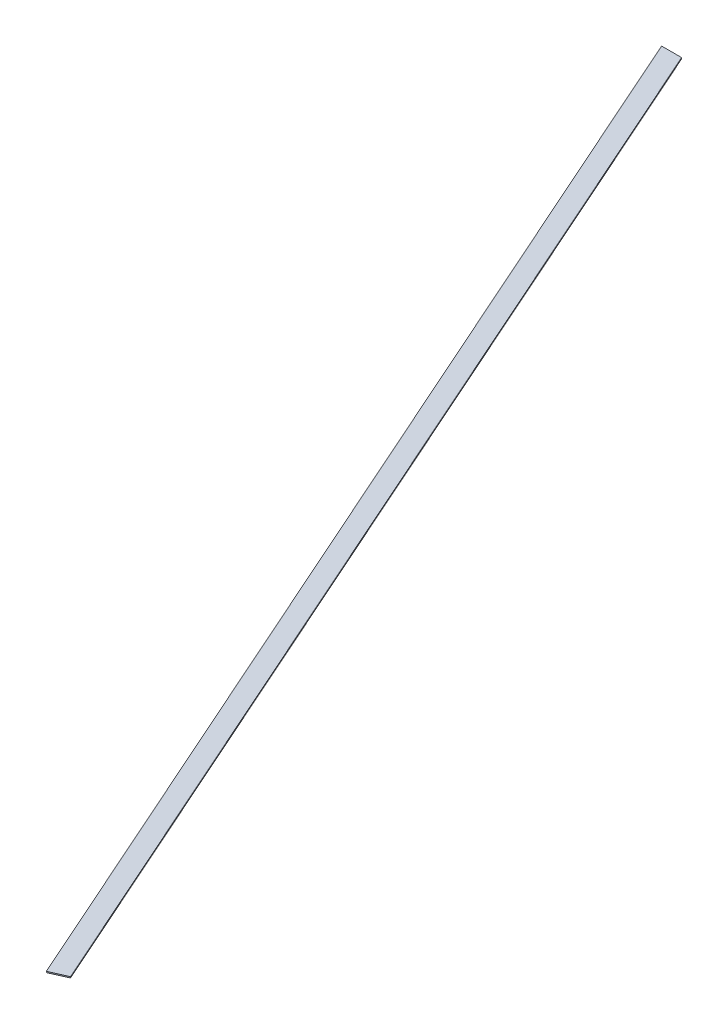
ISO-10303-21;
HEADER;
FILE_DESCRIPTION(('STEP AP214'),'2;1');
FILE_NAME('part.step','',(''),(''),'','','');
FILE_SCHEMA(('AUTOMOTIVE_DESIGN { 1 0 10303 214 1 1 1 1 }'));
ENDSEC;
DATA;
#1=APPLICATION_CONTEXT('core data for automotive mechanical design processes');
#2=APPLICATION_PROTOCOL_DEFINITION('international standard','automotive_design',2000,#1);
#3=PRODUCT_CONTEXT('',#1,'mechanical');
#4=PRODUCT('Part','Part','',(#3));
#5=PRODUCT_RELATED_PRODUCT_CATEGORY('part','',(#4));
#6=PRODUCT_DEFINITION_FORMATION('','',#4);
#7=PRODUCT_DEFINITION_CONTEXT('part definition',#1,'design');
#8=PRODUCT_DEFINITION('design','',#6,#7);
#9=PRODUCT_DEFINITION_SHAPE('','',#8);
#10=(LENGTH_UNIT() NAMED_UNIT(*) SI_UNIT(.MILLI.,.METRE.));
#11=(NAMED_UNIT(*) PLANE_ANGLE_UNIT() SI_UNIT($,.RADIAN.));
#12=(NAMED_UNIT(*) SI_UNIT($,.STERADIAN.) SOLID_ANGLE_UNIT());
#13=UNCERTAINTY_MEASURE_WITH_UNIT(LENGTH_MEASURE(1.E-05),#10,'distance_accuracy_value','');
#14=(GEOMETRIC_REPRESENTATION_CONTEXT(3) GLOBAL_UNCERTAINTY_ASSIGNED_CONTEXT((#13)) GLOBAL_UNIT_ASSIGNED_CONTEXT((#10,
#11,#12)) REPRESENTATION_CONTEXT('',''));
#15=CARTESIAN_POINT('',(0.,0.,0.));
#16=DIRECTION('',(0.,0.,1.));
#17=DIRECTION('',(1.,0.,0.));
#18=AXIS2_PLACEMENT_3D('',#15,#16,#17);
#19=CARTESIAN_POINT('',(27.8037614740545,3.175,2.45816780200209E-13));
#20=DIRECTION('',(-0.913545457642596,0.,0.406736643075811));
#21=DIRECTION('',(0.406736643075811,0.,0.913545457642596));
#22=AXIS2_PLACEMENT_3D('',#19,#20,#21);
#23=PLANE('',#22);
#24=DIRECTION('',(-0.40673664307581,0.,-0.913545457642596));
#25=VECTOR('',#24,1.);
#26=CARTESIAN_POINT('',(27.8037614740545,3.175,2.45816780200209E-13));
#27=LINE('',#26,#25);
#28=CARTESIAN_POINT('',(-444.327999075485,3.175,-1060.42529632237));
#29=VERTEX_POINT('',#28);
#30=CARTESIAN_POINT('',(-1804.22323283357,3.175,-4114.8));
#31=VERTEX_POINT('',#30);
#32=EDGE_CURVE('E85',#29,#31,#27,.T.);
#33=ORIENTED_EDGE('',*,*,#32,.F.);
#34=DIRECTION('',(0.,1.,0.));
#35=VECTOR('',#34,1.);
#36=CARTESIAN_POINT('',(-444.327999075485,0.,-1060.42529632237));
#37=LINE('',#36,#35);
#38=CARTESIAN_POINT('',(-444.327999075485,0.,-1060.42529632237));
#39=VERTEX_POINT('',#38);
#40=EDGE_CURVE('E92',#39,#29,#37,.T.);
#41=ORIENTED_EDGE('',*,*,#40,.F.);
#42=DIRECTION('',(-0.40673664307581,0.,-0.913545457642596));
#43=VECTOR('',#42,1.);
#44=CARTESIAN_POINT('',(27.8037614740545,0.,2.45816780200209E-13));
#45=LINE('',#44,#43);
#46=CARTESIAN_POINT('',(-1804.22323283357,0.,-4114.8));
#47=VERTEX_POINT('',#46);
#48=EDGE_CURVE('E77',#39,#47,#45,.T.);
#49=ORIENTED_EDGE('',*,*,#48,.T.);
#50=DIRECTION('',(0.,-1.,0.));
#51=VECTOR('',#50,1.);
#52=CARTESIAN_POINT('',(-1804.22323283357,3.175,-4114.8));
#53=LINE('',#52,#51);
#54=EDGE_CURVE('E11',#31,#47,#53,.T.);
#55=ORIENTED_EDGE('',*,*,#54,.F.);
#56=EDGE_LOOP('',(#33,#41,#49,#55));
#57=FACE_BOUND('',#56,.T.);
#58=ADVANCED_FACE('F33',(#57),#23,.F.);
#59=CARTESIAN_POINT('',(-1804.22323283357,3.175,-4114.8));
#60=DIRECTION('',(0.,0.,1.));
#61=DIRECTION('',(1.,0.,0.));
#62=AXIS2_PLACEMENT_3D('',#59,#60,#61);
#63=PLANE('',#62);
#64=DIRECTION('',(-1.,0.,0.));
#65=VECTOR('',#64,1.);
#66=CARTESIAN_POINT('',(-1804.22323283357,0.,-4114.8));
#67=LINE('',#66,#65);
#68=CARTESIAN_POINT('',(-1859.83075578167,0.,-4114.8));
#69=VERTEX_POINT('',#68);
#70=EDGE_CURVE('E68',#47,#69,#67,.T.);
#71=ORIENTED_EDGE('',*,*,#70,.T.);
#72=DIRECTION('',(0.,-1.,0.));
#73=VECTOR('',#72,1.);
#74=CARTESIAN_POINT('',(-1859.83075578167,3.175,-4114.8));
#75=LINE('',#74,#73);
#76=CARTESIAN_POINT('',(-1859.83075578167,3.175,-4114.8));
#77=VERTEX_POINT('',#76);
#78=EDGE_CURVE('E40',#77,#69,#75,.T.);
#79=ORIENTED_EDGE('',*,*,#78,.F.);
#80=DIRECTION('',(-1.,0.,0.));
#81=VECTOR('',#80,1.);
#82=CARTESIAN_POINT('',(-1804.22323283357,3.175,-4114.8));
#83=LINE('',#82,#81);
#84=EDGE_CURVE('E56',#31,#77,#83,.T.);
#85=ORIENTED_EDGE('',*,*,#84,.F.);
#86=ORIENTED_EDGE('',*,*,#54,.T.);
#87=EDGE_LOOP('',(#71,#79,#85,#86));
#88=FACE_BOUND('',#87,.T.);
#89=ADVANCED_FACE('F70',(#88),#63,.F.);
#90=CARTESIAN_POINT('',(-1859.83075578167,3.175,-4114.8));
#91=DIRECTION('',(0.913545457642596,0.,-0.40673664307581));
#92=DIRECTION('',(-0.40673664307581,0.,-0.913545457642596));
#93=AXIS2_PLACEMENT_3D('',#90,#91,#92);
#94=PLANE('',#93);
#95=DIRECTION('',(0.40673664307581,0.,0.913545457642597));
#96=VECTOR('',#95,1.);
#97=CARTESIAN_POINT('',(-1859.83075578167,0.,-4114.8));
#98=LINE('',#97,#96);
#99=CARTESIAN_POINT('',(-490.73610832373,0.,-1039.76307485412));
#100=VERTEX_POINT('',#99);
#101=EDGE_CURVE('E76',#69,#100,#98,.T.);
#102=ORIENTED_EDGE('',*,*,#101,.T.);
#103=DIRECTION('',(0.,1.,0.));
#104=VECTOR('',#103,1.);
#105=CARTESIAN_POINT('',(-490.73610832373,0.,-1039.76307485412));
#106=LINE('',#105,#104);
#107=CARTESIAN_POINT('',(-490.73610832373,3.175,-1039.76307485412));
#108=VERTEX_POINT('',#107);
#109=EDGE_CURVE('E47',#100,#108,#106,.T.);
#110=ORIENTED_EDGE('',*,*,#109,.T.);
#111=DIRECTION('',(0.40673664307581,0.,0.913545457642597));
#112=VECTOR('',#111,1.);
#113=CARTESIAN_POINT('',(-1859.83075578167,3.175,-4114.8));
#114=LINE('',#113,#112);
#115=EDGE_CURVE('E82',#77,#108,#114,.T.);
#116=ORIENTED_EDGE('',*,*,#115,.F.);
#117=ORIENTED_EDGE('',*,*,#78,.T.);
#118=EDGE_LOOP('',(#102,#110,#116,#117));
#119=FACE_BOUND('',#118,.T.);
#120=ADVANCED_FACE('F81',(#119),#94,.F.);
#121=CARTESIAN_POINT('',(0.,3.175,0.));
#122=DIRECTION('',(0.,1.,0.));
#123=DIRECTION('',(0.,0.,1.));
#124=AXIS2_PLACEMENT_3D('',#121,#122,#123);
#125=PLANE('',#124);
#126=DIRECTION('',(-0.913545457642596,0.,0.40673664307581));
#127=VECTOR('',#126,1.);
#128=CARTESIAN_POINT('',(-444.327999075485,3.175,-1060.42529632237));
#129=LINE('',#128,#127);
#130=EDGE_CURVE('E96',#29,#108,#129,.T.);
#131=ORIENTED_EDGE('',*,*,#130,.F.);
#132=ORIENTED_EDGE('',*,*,#32,.T.);
#133=ORIENTED_EDGE('',*,*,#84,.T.);
#134=ORIENTED_EDGE('',*,*,#115,.T.);
#135=EDGE_LOOP('',(#131,#132,#133,#134));
#136=FACE_BOUND('',#135,.T.);
#137=ADVANCED_FACE('F104',(#136),#125,.T.);
#138=CARTESIAN_POINT('',(0.,0.,0.));
#139=DIRECTION('',(0.,1.,0.));
#140=DIRECTION('',(0.,0.,1.));
#141=AXIS2_PLACEMENT_3D('',#138,#139,#140);
#142=PLANE('',#141);
#143=ORIENTED_EDGE('',*,*,#48,.F.);
#144=DIRECTION('',(-0.913545457642596,0.,0.40673664307581));
#145=VECTOR('',#144,1.);
#146=CARTESIAN_POINT('',(-444.327999075485,0.,-1060.42529632237));
#147=LINE('',#146,#145);
#148=EDGE_CURVE('E84',#39,#100,#147,.T.);
#149=ORIENTED_EDGE('',*,*,#148,.T.);
#150=ORIENTED_EDGE('',*,*,#101,.F.);
#151=ORIENTED_EDGE('',*,*,#70,.F.);
#152=EDGE_LOOP('',(#143,#149,#150,#151));
#153=FACE_BOUND('',#152,.T.);
#154=ADVANCED_FACE('F83',(#153),#142,.F.);
#155=CARTESIAN_POINT('',(-444.327999075485,0.,-1060.42529632237));
#156=DIRECTION('',(-0.40673664307581,0.,-0.913545457642597));
#157=DIRECTION('',(-0.913545457642597,0.,0.40673664307581));
#158=AXIS2_PLACEMENT_3D('',#155,#156,#157);
#159=PLANE('',#158);
#160=ORIENTED_EDGE('',*,*,#130,.T.);
#161=ORIENTED_EDGE('',*,*,#109,.F.);
#162=ORIENTED_EDGE('',*,*,#148,.F.);
#163=ORIENTED_EDGE('',*,*,#40,.T.);
#164=EDGE_LOOP('',(#160,#161,#162,#163));
#165=FACE_BOUND('',#164,.T.);
#166=ADVANCED_FACE('F100',(#165),#159,.F.);
#167=CLOSED_SHELL('',(#58,#89,#120,#137,#154,#166));
#168=MANIFOLD_SOLID_BREP('B2',#167);
#169=ADVANCED_BREP_SHAPE_REPRESENTATION('',(#18,#168),#14);
#170=SHAPE_DEFINITION_REPRESENTATION(#9,#169);
ENDSEC;
END-ISO-10303-21;
